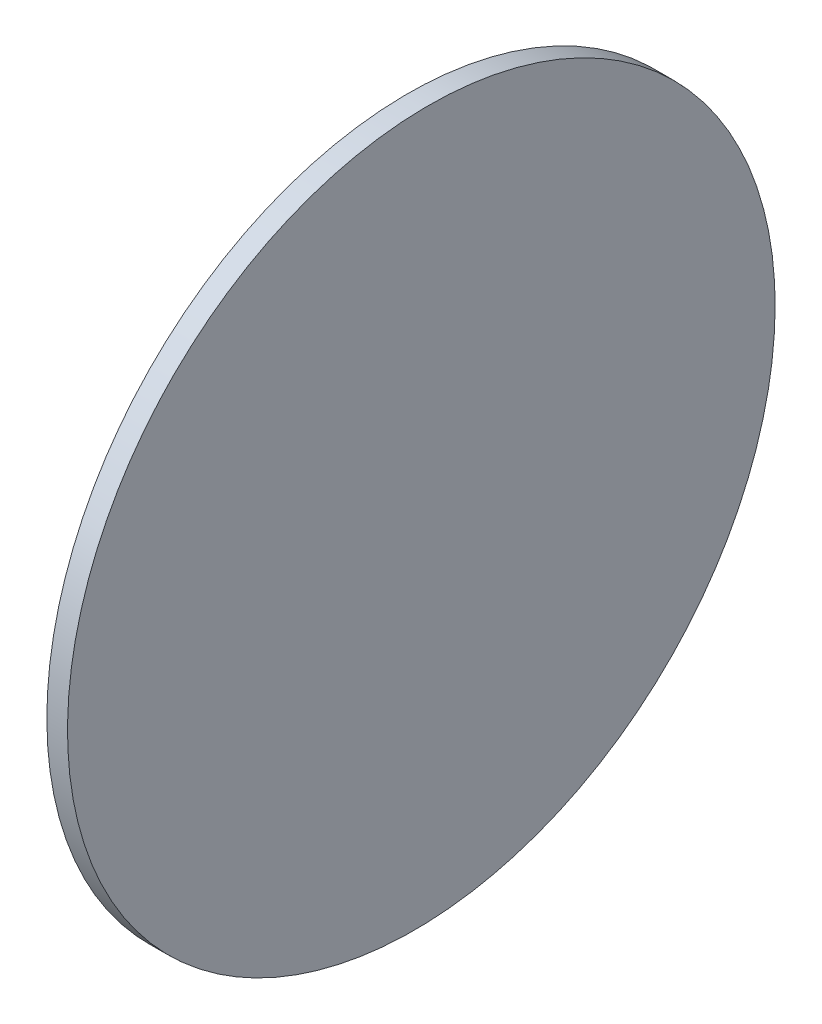
ISO-10303-21;
HEADER;
FILE_DESCRIPTION(('STEP AP214'),'2;1');
FILE_NAME('part.step','',(''),(''),'','','');
FILE_SCHEMA(('AUTOMOTIVE_DESIGN { 1 0 10303 214 1 1 1 1 }'));
ENDSEC;
DATA;
#1=APPLICATION_CONTEXT('core data for automotive mechanical design processes');
#2=APPLICATION_PROTOCOL_DEFINITION('international standard','automotive_design',2000,#1);
#3=PRODUCT_CONTEXT('',#1,'mechanical');
#4=PRODUCT('Part','Part','',(#3));
#5=PRODUCT_RELATED_PRODUCT_CATEGORY('part','',(#4));
#6=PRODUCT_DEFINITION_FORMATION('','',#4);
#7=PRODUCT_DEFINITION_CONTEXT('part definition',#1,'design');
#8=PRODUCT_DEFINITION('design','',#6,#7);
#9=PRODUCT_DEFINITION_SHAPE('','',#8);
#10=(LENGTH_UNIT() NAMED_UNIT(*) SI_UNIT(.MILLI.,.METRE.));
#11=(NAMED_UNIT(*) PLANE_ANGLE_UNIT() SI_UNIT($,.RADIAN.));
#12=(NAMED_UNIT(*) SI_UNIT($,.STERADIAN.) SOLID_ANGLE_UNIT());
#13=UNCERTAINTY_MEASURE_WITH_UNIT(LENGTH_MEASURE(1.E-05),#10,'distance_accuracy_value','');
#14=(GEOMETRIC_REPRESENTATION_CONTEXT(3) GLOBAL_UNCERTAINTY_ASSIGNED_CONTEXT((#13)) GLOBAL_UNIT_ASSIGNED_CONTEXT((#10,
#11,#12)) REPRESENTATION_CONTEXT('',''));
#15=CARTESIAN_POINT('',(0.,0.,0.));
#16=DIRECTION('',(0.,0.,1.));
#17=DIRECTION('',(1.,0.,0.));
#18=AXIS2_PLACEMENT_3D('',#15,#16,#17);
#19=CARTESIAN_POINT('',(172.576144765299,-46.4819307842796,22.7477112798652));
#20=CARTESIAN_POINT('',(172.588151885283,-46.482051063385,24.0263642070938));
#21=CARTESIAN_POINT('',(172.609643052937,-46.7341627331186,26.5836700615511));
#22=CARTESIAN_POINT('',(172.633071747198,-47.8534108071636,30.2722150984873));
#23=CARTESIAN_POINT('',(172.646792032658,-49.6707273748494,33.6715976734642));
#24=CARTESIAN_POINT('',(172.650276646441,-52.1162739796427,36.6511814205212));
#25=CARTESIAN_POINT('',(172.643391676793,-55.0960696369995,39.0964626072286));
#26=CARTESIAN_POINT('',(172.626401709236,-58.4956024708964,40.9134704489108));
#27=CARTESIAN_POINT('',(172.599959658696,-62.1842303410066,42.0323783532018));
#28=CARTESIAN_POINT('',(172.565081678347,-66.0202013468881,42.4101873168302));
#29=CARTESIAN_POINT('',(172.523108109413,-69.8561012740223,42.0323783532018));
#30=CARTESIAN_POINT('',(172.475651972609,-73.5445186394068,40.9134704489108));
#31=CARTESIAN_POINT('',(172.424536980659,-76.9437096321782,39.0964626072286));
#32=CARTESIAN_POINT('',(172.371727454038,-79.9230452487725,36.6511814205212));
#33=CARTESIAN_POINT('',(172.319252833238,-82.3680312922748,33.6715976734642));
#34=CARTESIAN_POINT('',(172.269129688508,-84.1847083201972,30.2722150984873));
#35=CARTESIAN_POINT('',(172.223284224192,-85.3032624531608,26.5836700615511));
#36=CARTESIAN_POINT('',(172.183478255771,-85.6807082831282,22.7477112798652));
#37=CARTESIAN_POINT('',(172.15124150429,-85.3025407785279,18.9117524981792));
#38=CARTESIAN_POINT('',(172.127812810029,-84.1832927044829,15.223207461243));
#39=CARTESIAN_POINT('',(172.114092524569,-82.3659761367971,11.8238248862661));
#40=CARTESIAN_POINT('',(172.110607910786,-79.9204295320038,8.84424113920915));
#41=CARTESIAN_POINT('',(172.117492880434,-76.940633874647,6.3989599525017));
#42=CARTESIAN_POINT('',(172.134482847991,-73.5411010407501,4.58195211081947));
#43=CARTESIAN_POINT('',(172.160924898531,-69.8524731706399,3.46304420652854));
#44=CARTESIAN_POINT('',(172.19580287888,-66.0165021647584,3.08523524290006));
#45=CARTESIAN_POINT('',(172.237776447814,-62.1806022376242,3.46304420652854));
#46=CARTESIAN_POINT('',(172.285232584618,-58.4921848722397,4.58195211081947));
#47=CARTESIAN_POINT('',(172.336347576568,-55.0929938794683,6.39895995250169));
#48=CARTESIAN_POINT('',(172.389157103189,-52.113658262874,8.84424113920914));
#49=CARTESIAN_POINT('',(172.441631723989,-49.6686722193717,11.8238248862661));
#50=CARTESIAN_POINT('',(172.491754868719,-47.8519951914493,15.223207461243));
#51=CARTESIAN_POINT('',(172.537600333035,-46.7334410584857,18.9117524981792));
#52=CARTESIAN_POINT('',(172.564137645316,-46.4818105051741,21.4690583526365));
#53=CARTESIAN_POINT('',(172.576144765299,-46.4819307842796,22.7477112798652));
#54=B_SPLINE_CURVE_WITH_KNOTS('',3,(#19,#20,#21,#22,#23,#24,#25,#26,#27,#28,#29,#30,#31,#32,#33,
#34,#35,#36,#37,#38,#39,#40,#41,#42,#43,#44,#45,#46,#47,#48,#49,#50,#51,#52,#53),.UNSPECIFIED.,
.T.,.F.,(4,1,1,1,1,1,1,1,1,1,1,1,1,1,1,1,1,1,1,1,1,1,1,1,1,1,1,1,1,1,1,1,4),(0.,0.03125,0.0625,
0.09375,0.125,0.15625,0.1875,0.21875,0.25,0.28125,0.3125,0.34375,0.375,0.40625,0.4375,0.46875,
0.5,0.53125,0.5625,0.59375,0.625,0.65625,0.6875,0.71875,0.75,0.78125,0.8125,0.84375,0.875,
0.90625,0.9375,0.96875,1.),.UNSPECIFIED.);
#55=DIRECTION('',(0.999905740949278,-0.0100163709739956,-0.00939050207319045));
#56=VECTOR('',#55,1.);
#57=SURFACE_OF_LINEAR_EXTRUSION('',#54,#56);
#58=CARTESIAN_POINT('',(172.576144765299,-46.4819307842796,22.7477112798652));
#59=CARTESIAN_POINT('',(172.588151885283,-46.482051063385,24.0263642070938));
#60=CARTESIAN_POINT('',(172.609643052937,-46.7341627331186,26.5836700615511));
#61=CARTESIAN_POINT('',(172.633071747198,-47.8534108071636,30.2722150984873));
#62=CARTESIAN_POINT('',(172.646792032658,-49.6707273748494,33.6715976734642));
#63=CARTESIAN_POINT('',(172.650276646441,-52.1162739796427,36.6511814205212));
#64=CARTESIAN_POINT('',(172.643391676793,-55.0960696369995,39.0964626072286));
#65=CARTESIAN_POINT('',(172.626401709236,-58.4956024708964,40.9134704489108));
#66=CARTESIAN_POINT('',(172.599959658696,-62.1842303410066,42.0323783532018));
#67=CARTESIAN_POINT('',(172.565081678347,-66.0202013468881,42.4101873168302));
#68=CARTESIAN_POINT('',(172.523108109413,-69.8561012740223,42.0323783532018));
#69=CARTESIAN_POINT('',(172.475651972609,-73.5445186394068,40.9134704489108));
#70=CARTESIAN_POINT('',(172.424536980659,-76.9437096321782,39.0964626072286));
#71=CARTESIAN_POINT('',(172.371727454038,-79.9230452487725,36.6511814205212));
#72=CARTESIAN_POINT('',(172.319252833238,-82.3680312922748,33.6715976734642));
#73=CARTESIAN_POINT('',(172.269129688508,-84.1847083201972,30.2722150984873));
#74=CARTESIAN_POINT('',(172.223284224192,-85.3032624531608,26.5836700615511));
#75=CARTESIAN_POINT('',(172.183478255771,-85.6807082831282,22.7477112798652));
#76=CARTESIAN_POINT('',(172.15124150429,-85.3025407785279,18.9117524981792));
#77=CARTESIAN_POINT('',(172.127812810029,-84.1832927044829,15.223207461243));
#78=CARTESIAN_POINT('',(172.114092524569,-82.3659761367971,11.8238248862661));
#79=CARTESIAN_POINT('',(172.110607910786,-79.9204295320038,8.84424113920915));
#80=CARTESIAN_POINT('',(172.117492880434,-76.940633874647,6.3989599525017));
#81=CARTESIAN_POINT('',(172.134482847991,-73.5411010407501,4.58195211081947));
#82=CARTESIAN_POINT('',(172.160924898531,-69.8524731706399,3.46304420652854));
#83=CARTESIAN_POINT('',(172.19580287888,-66.0165021647584,3.08523524290006));
#84=CARTESIAN_POINT('',(172.237776447814,-62.1806022376242,3.46304420652854));
#85=CARTESIAN_POINT('',(172.285232584618,-58.4921848722397,4.58195211081947));
#86=CARTESIAN_POINT('',(172.336347576568,-55.0929938794683,6.39895995250169));
#87=CARTESIAN_POINT('',(172.389157103189,-52.113658262874,8.84424113920914));
#88=CARTESIAN_POINT('',(172.441631723989,-49.6686722193717,11.8238248862661));
#89=CARTESIAN_POINT('',(172.491754868719,-47.8519951914493,15.223207461243));
#90=CARTESIAN_POINT('',(172.537600333035,-46.7334410584857,18.9117524981792));
#91=CARTESIAN_POINT('',(172.564137645316,-46.4818105051741,21.4690583526365));
#92=CARTESIAN_POINT('',(172.576144765299,-46.4819307842795,22.7477112798652));
#93=B_SPLINE_CURVE_WITH_KNOTS('',3,(#58,#59,#60,#61,#62,#63,#64,#65,#66,#67,#68,#69,#70,#71,#72,
#73,#74,#75,#76,#77,#78,#79,#80,#81,#82,#83,#84,#85,#86,#87,#88,#89,#90,#91,#92),.UNSPECIFIED.,
.T.,.F.,(4,1,1,1,1,1,1,1,1,1,1,1,1,1,1,1,1,1,1,1,1,1,1,1,1,1,1,1,1,1,1,1,4),(0.,0.03125,0.0625,
0.09375,0.125,0.15625,0.1875,0.21875,0.25,0.28125,0.3125,0.34375,0.375,0.40625,0.4375,0.46875,
0.5,0.53125,0.5625,0.59375,0.625,0.65625,0.6875,0.71875,0.75,0.78125,0.8125,0.84375,0.875,
0.90625,0.9375,0.96875,1.),.UNSPECIFIED.);
#94=CARTESIAN_POINT('',(172.576144765299,-46.4819307842796,22.7477112798652));
#95=VERTEX_POINT('',#94);
#96=EDGE_CURVE('E9',#95,#95,#93,.T.);
#97=ORIENTED_EDGE('',*,*,#96,.T.);
#98=EDGE_LOOP('',(#97));
#99=FACE_BOUND('',#98,.T.);
#100=CARTESIAN_POINT('',(173.695451924726,-46.4931432368974,22.7371994328273));
#101=CARTESIAN_POINT('',(173.692450125634,-46.4931132332414,22.4175342381722));
#102=CARTESIAN_POINT('',(173.689369502766,-46.5009541634282,22.0978713699998));
#103=CARTESIAN_POINT('',(173.683058533438,-46.5323022998333,21.4593134046187));
#104=CARTESIAN_POINT('',(173.679828185816,-46.5558096277449,21.1404183133933));
#105=CARTESIAN_POINT('',(173.673225737827,-46.6184149660599,20.50416400994));
#106=CARTESIAN_POINT('',(173.669853637459,-46.6575129764632,20.1868047977122));
#107=CARTESIAN_POINT('',(173.662975631274,-46.7512246080171,19.5543884095292));
#108=CARTESIAN_POINT('',(173.659469726497,-46.8058381086428,19.2393312157115));
#109=CARTESIAN_POINT('',(173.652332093129,-46.930505014563,18.6122880014878));
#110=CARTESIAN_POINT('',(173.648700364539,-47.0005584198575,18.300301981082));
#111=CARTESIAN_POINT('',(173.641320275868,-47.1558806839453,17.6801405064144));
#112=CARTESIAN_POINT('',(173.637571914881,-47.2411496609263,17.3719650817716));
#113=CARTESIAN_POINT('',(173.629967723381,-47.4266794608258,16.7601618588545));
#114=CARTESIAN_POINT('',(173.626111892868,-47.5269402837442,16.4565340605804));
#115=CARTESIAN_POINT('',(173.618301921399,-47.7422305729177,15.8545632754434));
#116=CARTESIAN_POINT('',(173.614347781205,-47.8572599244464,15.5562202475474));
#117=CARTESIAN_POINT('',(173.606350381615,-48.1018629953408,14.9655584681827));
#118=CARTESIAN_POINT('',(173.602307122218,-48.2314367147065,14.673239716714));
#119=CARTESIAN_POINT('',(173.594141533915,-48.5047641238662,14.0953079030036));
#120=CARTESIAN_POINT('',(173.590019204395,-48.6485179238009,13.8096948928685));
#121=CARTESIAN_POINT('',(173.581705492313,-48.9498423885281,13.2458538143099));
#122=CARTESIAN_POINT('',(173.577514109751,-49.1074130533206,12.9676257458864));
#123=CARTESIAN_POINT('',(173.569072306325,-49.4360085125163,12.4192340146386));
#124=CARTESIAN_POINT('',(173.564821885921,-49.6070332024006,12.1490702891881));
#125=CARTESIAN_POINT('',(173.556272055554,-49.962172480105,11.6174887319084));
#126=CARTESIAN_POINT('',(173.551972645591,-50.1462870679252,11.356070900079));
#127=CARTESIAN_POINT('',(173.543335356671,-50.5271158029257,10.8425783464918));
#128=CARTESIAN_POINT('',(173.538997477417,-50.7238300479669,10.5905036973259));
#129=CARTESIAN_POINT('',(173.530293736036,-51.1293694473756,10.0962928585849));
#130=CARTESIAN_POINT('',(173.525927873909,-51.3381946017431,9.85415666900976));
#131=CARTESIAN_POINT('',(173.517178652302,-51.7674674917295,9.38041837860503));
#132=CARTESIAN_POINT('',(173.512795292959,-51.9879151370536,9.14881619596304));
#133=CARTESIAN_POINT('',(173.504021597,-52.4399428182939,8.69674324182938));
#134=CARTESIAN_POINT('',(173.499631260384,-52.67152285421,8.47627247033771));
#135=CARTESIAN_POINT('',(173.490854197018,-53.1452178803355,8.04695240775705));
#136=CARTESIAN_POINT('',(173.486467470297,-53.3873329523653,7.83810320695573));
#137=CARTESIAN_POINT('',(173.477708179516,-53.8815026347655,7.43251485340335));
#138=CARTESIAN_POINT('',(173.473335615458,-54.133557245136,7.23577570065228));
#139=CARTESIAN_POINT('',(173.464615203349,-54.6470108494899,6.85489634791677));
#140=CARTESIAN_POINT('',(173.460267355108,-54.9084097708726,6.6707560500777));
#141=CARTESIAN_POINT('',(173.451606961773,-55.4399546853587,6.31556460919172));
#142=CARTESIAN_POINT('',(173.447294416679,-55.710100678462,6.14451346614481));
#143=CARTESIAN_POINT('',(173.438714876489,-56.2584581615097,5.81586442381034));
#144=CARTESIAN_POINT('',(173.434447881748,-56.5366697140896,5.6582666290364));
#145=CARTESIAN_POINT('',(173.425969656201,-57.1004790157203,5.35688729364308));
#146=CARTESIAN_POINT('',(173.421758425395,-57.3860767647711,5.21310575302371));
#147=CARTESIAN_POINT('',(173.413401943332,-57.9639793494254,4.93972231788344));
#148=CARTESIAN_POINT('',(173.409256691562,-58.2562841329121,4.81012031322618));
#149=CARTESIAN_POINT('',(173.40104241491,-58.846919307674,4.56546019346748));
#150=CARTESIAN_POINT('',(173.396973390027,-59.1452496989493,4.45040207836603));
#151=CARTESIAN_POINT('',(173.388921079932,-59.747196568368,4.23505385466615));
#152=CARTESIAN_POINT('',(173.384937795386,-60.0508130875553,4.13476386079088));
#153=CARTESIAN_POINT('',(173.377066448526,-60.6625951331427,3.94917538240032));
#154=CARTESIAN_POINT('',(173.373178386211,-60.9707606595429,3.86387689788502));
#155=CARTESIAN_POINT('',(173.365506969112,-61.5909037522607,3.70849535243725));
#156=CARTESIAN_POINT('',(173.361723613515,-61.9028812889484,3.63841217331914));
#157=CARTESIAN_POINT('',(173.354271123591,-62.5299089454522,3.51368552588305));
#158=CARTESIAN_POINT('',(173.350601989263,-62.8449590652683,3.45904205756508));
#159=CARTESIAN_POINT('',(173.343386355024,-63.477362840442,3.36527036396791));
#160=CARTESIAN_POINT('',(173.339839856064,-63.7947165136744,3.32614225921267));
#161=CARTESIAN_POINT('',(173.332877879336,-64.4309608622979,3.26347669897019));
#162=CARTESIAN_POINT('',(173.329462401567,-64.7498515376891,3.23993924348296));
#163=CARTESIAN_POINT('',(173.322770857689,-65.3884033871976,3.20853081338026));
#164=CARTESIAN_POINT('',(173.319494790498,-65.7080645553104,3.2006597170717));
#165=CARTESIAN_POINT('',(173.31309048231,-66.3473883723578,3.2006597170717));
#166=CARTESIAN_POINT('',(173.309962241313,-66.6670510212923,3.20853081338026));
#167=CARTESIAN_POINT('',(173.303860575706,-67.3056087797972,3.23993924348295));
#168=CARTESIAN_POINT('',(173.3008871523,-67.6245038833863,3.26347669897019));
#169=CARTESIAN_POINT('',(173.295102090564,-68.2607600215383,3.32614225921267));
#170=CARTESIAN_POINT('',(173.292290452236,-68.5781210561012,3.36527036396791));
#171=CARTESIAN_POINT('',(173.286835933859,-69.2105424729277,3.45904205756508));
#172=CARTESIAN_POINT('',(173.284193052499,-69.5256028730432,3.51368552588305));
#173=CARTESIAN_POINT('',(173.279083040019,-70.1526539948819,3.63841217331913));
#174=CARTESIAN_POINT('',(173.276615908899,-70.4646447166051,3.70849535243725));
#175=CARTESIAN_POINT('',(173.271862695513,-71.0848170418893,3.86387689788502));
#176=CARTESIAN_POINT('',(173.269576614653,-71.3929986158426,3.94917538240032));
#177=CARTESIAN_POINT('',(173.265190784589,-72.0048155769504,4.13476386079088));
#178=CARTESIAN_POINT('',(173.263091035385,-72.3084509641049,4.23505385466615));
#179=CARTESIAN_POINT('',(173.25908315659,-72.9104383478668,4.45040207836602));
#180=CARTESIAN_POINT('',(173.25717502551,-73.2087903854963,4.56546019346747));
#181=CARTESIAN_POINT('',(173.253555683653,-73.7994715891684,4.81012031322618));
#182=CARTESIAN_POINT('',(173.251844472876,-74.091800755211,4.93972231788344));
#183=CARTESIAN_POINT('',(173.248622375034,-74.6697547726103,5.2131057530237));
#184=CARTESIAN_POINT('',(173.247111489526,-74.9553795718711,5.35688729364307));
#185=CARTESIAN_POINT('',(173.244293436123,-75.5192455732303,5.65826662903639));
#186=CARTESIAN_POINT('',(173.242986268229,-75.7974867753286,5.81586442381034));
#187=CARTESIAN_POINT('',(173.240579049551,-76.3459060884664,6.14451346614481));
#188=CARTESIAN_POINT('',(173.239478997158,-76.6160842621217,6.31556460919172));
#189=CARTESIAN_POINT('',(173.237489415201,-77.1476960002279,6.6707560500777));
#190=CARTESIAN_POINT('',(173.236599885637,-77.4091295646789,6.85489634791677));
#191=CARTESIAN_POINT('',(173.235032726753,-77.922654825425,7.23577570065228));
#192=CARTESIAN_POINT('',(173.23435509908,-78.1747464491379,7.43251485340335));
#193=CARTESIAN_POINT('',(173.23321311855,-78.6689924365359,7.83810320695573));
#194=CARTESIAN_POINT('',(173.232748765694,-78.911146800221,8.04695240775705));
#195=CARTESIAN_POINT('',(173.232034715196,-79.3849225960878,8.4762724703377));
#196=CARTESIAN_POINT('',(173.231785015887,-79.6165441100729,8.69674324182938));
#197=CARTESIAN_POINT('',(173.231501652349,-80.0686568416492,9.14881619596304));
#198=CARTESIAN_POINT('',(173.23146798812,-80.2891480592403,9.38041837860502));
#199=CARTESIAN_POINT('',(173.231615993232,-80.7185100755511,9.85415666900976));
#200=CARTESIAN_POINT('',(173.231797664245,-80.9273807839914,10.0962928585849));
#201=CARTESIAN_POINT('',(173.23237564226,-81.3330131613088,10.5905036973259));
#202=CARTESIAN_POINT('',(173.232771949262,-81.529774830186,10.8425783464918));
#203=CARTESIAN_POINT('',(173.233778507505,-81.9107001706433,11.3560709000791));
#204=CARTESIAN_POINT('',(173.234388757084,-82.0948639400706,11.6174887319085));
#205=CARTESIAN_POINT('',(173.235822501467,-82.4501032263901,12.1490702891879));
#206=CARTESIAN_POINT('',(173.236645996271,-82.6211787432823,12.4192340146379));
#207=CARTESIAN_POINT('',(173.238503477624,-82.9498773736599,12.9676257458871));
#208=CARTESIAN_POINT('',(173.239537465808,-83.1075003826383,13.2458538143125));
#209=CARTESIAN_POINT('',(173.241813190996,-83.4089309250961,13.8096948928659));
#210=CARTESIAN_POINT('',(173.243054928001,-83.5527384585756,14.095307902994));
#211=CARTESIAN_POINT('',(173.245743413516,-83.8261745964149,14.6732397167236));
#212=CARTESIAN_POINT('',(173.247190160433,-83.9558033109056,14.9655584682184));
#213=CARTESIAN_POINT('',(173.250285914745,-84.2005175054156,15.5562202475117));
#214=CARTESIAN_POINT('',(173.251934922138,-84.3156029854349,15.8545632753102));
#215=CARTESIAN_POINT('',(173.255430497766,-84.5310065258503,16.4565340607136));
#216=CARTESIAN_POINT('',(173.257277067535,-84.6313244715277,16.7601618593516));
#217=CARTESIAN_POINT('',(173.261163085055,-84.8169693724235,17.3719650812744));
#218=CARTESIAN_POINT('',(173.263202532805,-84.9022963276418,17.6801405045591));
#219=CARTESIAN_POINT('',(173.267469628601,-85.0577352654308,18.3003019829372));
#220=CARTESIAN_POINT('',(173.269697275185,-85.1278473661835,18.6122880084117));
#221=CARTESIAN_POINT('',(173.274336071322,-85.2526322396263,19.2393312087876));
#222=CARTESIAN_POINT('',(173.276747220875,-85.3073050123164,19.554388383689));
#223=CARTESIAN_POINT('',(173.281746557767,-85.401135625511,20.1868048235526));
#224=CARTESIAN_POINT('',(173.284334746481,-85.4402933454941,20.5041641063782));
#225=CARTESIAN_POINT('',(173.289681718857,-85.5030183753972,21.140418216955));
#226=CARTESIAN_POINT('',(173.29244050252,-85.5265856853173,21.4593130447063));
#227=CARTESIAN_POINT('',(173.298122226499,-85.5580539918478,22.0978717299094));
#228=CARTESIAN_POINT('',(173.30104516554,-85.5659551101501,22.4175355813684));
#229=CARTESIAN_POINT('',(173.307048737169,-85.5660152498194,23.0568632842863));
#230=CARTESIAN_POINT('',(173.310129369757,-85.5581742711865,23.3765271357452));
#231=CARTESIAN_POINT('',(173.3164403462,-85.5268260993161,24.0150858209483));
#232=CARTESIAN_POINT('',(173.319670691218,-85.5033187843858,24.3339806486996));
#233=CARTESIAN_POINT('',(173.326273137301,-85.4407134555737,24.9702347592764));
#234=CARTESIAN_POINT('',(173.329645238366,-85.401615441692,25.287594042102));
#235=CARTESIAN_POINT('',(173.336523245062,-85.3079038075918,25.9200104819656));
#236=CARTESIAN_POINT('',(173.340029149652,-85.2532903078982,26.235067656867));
#237=CARTESIAN_POINT('',(173.347166782883,-85.1286234026603,26.8621108572429));
#238=CARTESIAN_POINT('',(173.350798511523,-85.058569997116,27.1740968827174));
#239=CARTESIAN_POINT('',(173.358178600231,-84.9032477328454,27.7942583610955));
#240=CARTESIAN_POINT('',(173.361926961205,-84.8179787559313,28.1024337843802));
#241=CARTESIAN_POINT('',(173.369531152695,-84.6324489560809,28.714237006303));
#242=CARTESIAN_POINT('',(173.373386983211,-84.5321881331444,29.017864804941));
#243=CARTESIAN_POINT('',(173.381196954683,-84.3168978439579,29.6198355903444));
#244=CARTESIAN_POINT('',(173.385151094876,-84.201868492434,29.9181786181429));
#245=CARTESIAN_POINT('',(173.393148494465,-83.9572654215431,30.5088403974362));
#246=CARTESIAN_POINT('',(173.397191753863,-83.8276917021762,30.801159148931));
#247=CARTESIAN_POINT('',(173.405357342166,-83.5543642930154,31.3790909626606));
#248=CARTESIAN_POINT('',(173.409479671686,-83.4106104930811,31.6647039727887));
#249=CARTESIAN_POINT('',(173.417793383768,-83.1092860283541,32.2285450513421));
#250=CARTESIAN_POINT('',(173.42198476633,-82.9517153635615,32.5067731197675));
#251=CARTESIAN_POINT('',(173.430426569755,-82.6231199043658,33.0551648510167));
#252=CARTESIAN_POINT('',(173.434676990159,-82.4520952144815,33.3253285764666));
#253=CARTESIAN_POINT('',(173.443226820527,-82.0969559367771,33.856910133746));
#254=CARTESIAN_POINT('',(173.44752623049,-81.9128413489569,34.1183279655755));
#255=CARTESIAN_POINT('',(173.456163519409,-81.5320126139564,34.6318205191628));
#256=CARTESIAN_POINT('',(173.460501398663,-81.3352983689152,34.8838951683287));
#257=CARTESIAN_POINT('',(173.469205140045,-80.9297589695065,35.3781060070697));
#258=CARTESIAN_POINT('',(173.473571002172,-80.7209338151391,35.6202421966448));
#259=CARTESIAN_POINT('',(173.482320223778,-80.2916609251527,36.0939804870496));
#260=CARTESIAN_POINT('',(173.486703583122,-80.0712132798285,36.3255826696916));
#261=CARTESIAN_POINT('',(173.495477279081,-79.6191855985882,36.7776556238252));
#262=CARTESIAN_POINT('',(173.499867615697,-79.3876055626721,36.9981263953169));
#263=CARTESIAN_POINT('',(173.508644679062,-78.9139105365466,37.4274464578975));
#264=CARTESIAN_POINT('',(173.513031405784,-78.6717954645169,37.6362956586989));
#265=CARTESIAN_POINT('',(173.521790696564,-78.1776257821166,38.0418840122512));
#266=CARTESIAN_POINT('',(173.526163260623,-77.9255711717462,38.2386231650023));
#267=CARTESIAN_POINT('',(173.534883672731,-77.4121175673922,38.6195025177378));
#268=CARTESIAN_POINT('',(173.539231520973,-77.1507186460095,38.8036428155769));
#269=CARTESIAN_POINT('',(173.547891914308,-76.6191737315235,39.1588342564629));
#270=CARTESIAN_POINT('',(173.552204459402,-76.3490277384201,39.3298853995098));
#271=CARTESIAN_POINT('',(173.560783999591,-75.8006702553725,39.6585344418443));
#272=CARTESIAN_POINT('',(173.565050994332,-75.5224587027925,39.8161322366182));
#273=CARTESIAN_POINT('',(173.57352921988,-74.9586494011618,40.1175115720115));
#274=CARTESIAN_POINT('',(173.577740450685,-74.673051652111,40.2612931126309));
#275=CARTESIAN_POINT('',(173.586096932749,-74.0951490674568,40.5346765477712));
#276=CARTESIAN_POINT('',(173.590242184518,-73.8028442839701,40.6642785524284));
#277=CARTESIAN_POINT('',(173.598456461171,-73.2122091092081,40.9089386721871));
#278=CARTESIAN_POINT('',(173.602525486053,-72.9138787179329,41.0239967872886));
#279=CARTESIAN_POINT('',(173.610577796148,-72.3119318485141,41.2393450109885));
#280=CARTESIAN_POINT('',(173.614561080694,-72.0083153293268,41.3396350048637));
#281=CARTESIAN_POINT('',(173.622432427555,-71.3965332837394,41.5252234832543));
#282=CARTESIAN_POINT('',(173.62632048987,-71.0883677573392,41.6105219677696));
#283=CARTESIAN_POINT('',(173.633991906968,-70.4682246646215,41.7659035132174));
#284=CARTESIAN_POINT('',(173.637775262566,-70.1562471279337,41.8359866923355));
#285=CARTESIAN_POINT('',(173.64522775249,-69.5292194714299,41.9607133397716));
#286=CARTESIAN_POINT('',(173.648896886817,-69.2141693516139,42.0153568080895));
#287=CARTESIAN_POINT('',(173.656112521057,-68.5817655764401,42.1091285016867));
#288=CARTESIAN_POINT('',(173.659659020016,-68.2644119032078,42.1482566064419));
#289=CARTESIAN_POINT('',(173.666620996745,-67.6281675545842,42.2109221666844));
#290=CARTESIAN_POINT('',(173.670036474514,-67.309276879193,42.2344596221716));
#291=CARTESIAN_POINT('',(173.676728018391,-66.6707250296846,42.2658680522743));
#292=CARTESIAN_POINT('',(173.680004085582,-66.3510638615717,42.2737391485829));
#293=CARTESIAN_POINT('',(173.68640839377,-65.7117400445243,42.2737391485829));
#294=CARTESIAN_POINT('',(173.689536634767,-65.3920773955899,42.2658680522743));
#295=CARTESIAN_POINT('',(173.695638300374,-64.7535196370849,42.2344596221716));
#296=CARTESIAN_POINT('',(173.698611723781,-64.4346245334958,42.2109221666844));
#297=CARTESIAN_POINT('',(173.704396785516,-63.7983683953438,42.1482566064419));
#298=CARTESIAN_POINT('',(173.707208423845,-63.4810073607809,42.1091285016867));
#299=CARTESIAN_POINT('',(173.712662942222,-62.8485859439545,42.0153568080895));
#300=CARTESIAN_POINT('',(173.715305823582,-62.533525543839,41.9607133397715));
#301=CARTESIAN_POINT('',(173.720415836061,-61.9064744220002,41.8359866923355));
#302=CARTESIAN_POINT('',(173.722882967181,-61.594483700277,41.7659035132173));
#303=CARTESIAN_POINT('',(173.727636180568,-60.9743113749929,41.6105219677696));
#304=CARTESIAN_POINT('',(173.729922261428,-60.6661298010395,41.5252234832543));
#305=CARTESIAN_POINT('',(173.734308091492,-60.0543128399317,41.3396350048637));
#306=CARTESIAN_POINT('',(173.736407840695,-59.7506774527773,41.2393450109884));
#307=CARTESIAN_POINT('',(173.74041571949,-59.1486900690154,41.0239967872886));
#308=CARTESIAN_POINT('',(173.74232385057,-58.8503380313858,40.9089386721871));
#309=CARTESIAN_POINT('',(173.745943192428,-58.2596568277137,40.6642785524284));
#310=CARTESIAN_POINT('',(173.747654403205,-57.9673276616711,40.5346765477712));
#311=CARTESIAN_POINT('',(173.750876501047,-57.3893736442718,40.2612931126309));
#312=CARTESIAN_POINT('',(173.752387386555,-57.103748845011,40.1175115720115));
#313=CARTESIAN_POINT('',(173.755205439957,-56.5398828436519,39.8161322366182));
#314=CARTESIAN_POINT('',(173.756512607851,-56.2616416415535,39.6585344418443));
#315=CARTESIAN_POINT('',(173.75891982653,-55.7132223284157,39.3298853995098));
#316=CARTESIAN_POINT('',(173.760019878923,-55.4430441547605,39.1588342564629));
#317=CARTESIAN_POINT('',(173.76200946088,-54.9114324166542,38.8036428155769));
#318=CARTESIAN_POINT('',(173.762898990444,-54.6499988522033,38.6195025177378));
#319=CARTESIAN_POINT('',(173.764466149328,-54.1364735914571,38.2386231650023));
#320=CARTESIAN_POINT('',(173.765143777001,-53.8843819677442,38.0418840122512));
#321=CARTESIAN_POINT('',(173.76628575753,-53.3901359803462,37.6362956586989));
#322=CARTESIAN_POINT('',(173.766750110386,-53.1479816166611,37.4274464578976));
#323=CARTESIAN_POINT('',(173.767464160884,-52.6742058207943,36.9981263953169));
#324=CARTESIAN_POINT('',(173.767713860193,-52.4425843068092,36.7776556238252));
#325=CARTESIAN_POINT('',(173.767997223732,-51.990471575233,36.3255826696916));
#326=CARTESIAN_POINT('',(173.76803088796,-51.7699803576418,36.0939804870496));
#327=CARTESIAN_POINT('',(173.767882882849,-51.340618341331,35.6202421966448));
#328=CARTESIAN_POINT('',(173.767701211836,-51.1317476328907,35.3781060070697));
#329=CARTESIAN_POINT('',(173.767123233821,-50.7261152555733,34.8838951683287));
#330=CARTESIAN_POINT('',(173.766726926819,-50.5293535866962,34.6318205191628));
#331=CARTESIAN_POINT('',(173.765720368576,-50.1484282462389,34.1183279655755));
#332=CARTESIAN_POINT('',(173.765110118997,-49.9642644768116,33.8569101337462));
#333=CARTESIAN_POINT('',(173.763676374614,-49.609025190492,33.3253285764665));
#334=CARTESIAN_POINT('',(173.76285287981,-49.4379496735998,33.055164851016));
#335=CARTESIAN_POINT('',(173.760995398457,-49.1092510432223,32.5067731197681));
#336=CARTESIAN_POINT('',(173.759961410273,-48.951628034244,32.2285450513447));
#337=CARTESIAN_POINT('',(173.757685685084,-48.6501974917859,31.6647039727861));
#338=CARTESIAN_POINT('',(173.75644394808,-48.5063899583061,31.379090962651));
#339=CARTESIAN_POINT('',(173.753755462565,-48.2329538204677,30.8011591489406));
#340=CARTESIAN_POINT('',(173.752308715647,-48.1033251059783,30.5088403974719));
#341=CARTESIAN_POINT('',(173.749212961336,-47.8586109114648,29.9181786181072));
#342=CARTESIAN_POINT('',(173.747563953942,-47.7435254314406,29.6198355902112));
#343=CARTESIAN_POINT('',(173.744068378316,-47.5281218910384,29.0178648050742));
#344=CARTESIAN_POINT('',(173.74222180855,-47.427803945379,28.7142370068001));
#345=CARTESIAN_POINT('',(173.738335791022,-47.2421590444341,28.102433783883));
#346=CARTESIAN_POINT('',(173.736296343259,-47.1568320891485,27.7942583592402));
#347=CARTESIAN_POINT('',(173.732029247496,-47.0013931515431,27.1740968845726));
#348=CARTESIAN_POINT('',(173.729801600957,-46.931281051041,26.8621108641668));
#349=CARTESIAN_POINT('',(173.725162804697,-46.8064961769133,26.2350676499431));
#350=CARTESIAN_POINT('',(173.722751654975,-46.7518234032878,25.9200104561254));
#351=CARTESIAN_POINT('',(173.717752318543,-46.6579927926491,25.2875940679424));
#352=CARTESIAN_POINT('',(173.715164130458,-46.6188350761577,24.9702348557146));
#353=CARTESIAN_POINT('',(173.709817156366,-46.5561100367153,24.3339805522613));
#354=CARTESIAN_POINT('',(173.707058370359,-46.5325427137644,24.0150854610359));
#355=CARTESIAN_POINT('',(173.701376652784,-46.5010744428346,23.3765274956548));
#356=CARTESIAN_POINT('',(173.69845372249,-46.4931733731634,23.0568646274824));
#357=CARTESIAN_POINT('',(173.695451924726,-46.4931432368974,22.7371994328273));
#358=B_SPLINE_CURVE_WITH_KNOTS('',3,(#100,#101,#102,#103,#104,#105,#106,#107,#108,#109,#110,
#111,#112,#113,#114,#115,#116,#117,#118,#119,#120,#121,#122,#123,#124,#125,#126,#127,#128,#129,
#130,#131,#132,#133,#134,#135,#136,#137,#138,#139,#140,#141,#142,#143,#144,#145,#146,#147,#148,
#149,#150,#151,#152,#153,#154,#155,#156,#157,#158,#159,#160,#161,#162,#163,#164,#165,#166,#167,
#168,#169,#170,#171,#172,#173,#174,#175,#176,#177,#178,#179,#180,#181,#182,#183,#184,#185,#186,
#187,#188,#189,#190,#191,#192,#193,#194,#195,#196,#197,#198,#199,#200,#201,#202,#203,#204,#205,
#206,#207,#208,#209,#210,#211,#212,#213,#214,#215,#216,#217,#218,#219,#220,#221,#222,#223,#224,
#225,#226,#227,#228,#229,#230,#231,#232,#233,#234,#235,#236,#237,#238,#239,#240,#241,#242,#243,
#244,#245,#246,#247,#248,#249,#250,#251,#252,#253,#254,#255,#256,#257,#258,#259,#260,#261,#262,
#263,#264,#265,#266,#267,#268,#269,#270,#271,#272,#273,#274,#275,#276,#277,#278,#279,#280,#281,
#282,#283,#284,#285,#286,#287,#288,#289,#290,#291,#292,#293,#294,#295,#296,#297,#298,#299,#300,
#301,#302,#303,#304,#305,#306,#307,#308,#309,#310,#311,#312,#313,#314,#315,#316,#317,#318,#319,
#320,#321,#322,#323,#324,#325,#326,#327,#328,#329,#330,#331,#332,#333,#334,#335,#336,#337,#338,
#339,#340,#341,#342,#343,#344,#345,#346,#347,#348,#349,#350,#351,#352,#353,#354,#355,#356,#357),
.UNSPECIFIED.,.F.,.F.,(4,2,2,2,2,2,2,2,2,2,2,2,2,2,2,2,2,2,2,2,2,2,2,2,2,2,2,2,2,2,2,2,2,2,2,2,
2,2,2,2,2,2,2,2,2,2,2,2,2,2,2,2,2,2,2,2,2,2,2,2,2,2,2,2,2,2,2,2,2,2,2,2,2,2,2,2,2,2,2,2,2,2,2,2,
2,2,2,2,2,2,2,2,2,2,2,2,2,2,2,2,2,2,2,2,2,2,2,2,2,2,2,2,2,2,2,2,2,2,2,2,2,2,2,2,2,2,2,2,4),(0.,
0.958937939115195,1.91788332715284,2.87682871519048,3.83576665430568,4.79470459342089,
5.75364998145853,6.71259536949617,7.67153330861137,8.63047124772658,9.58941663576421,
10.5483620238019,11.5072999629171,12.4662379020322,13.4251832900699,14.3841286781075,
15.3430666172227,16.3020045563379,17.2609499443756,18.2198953324132,19.1788332715284,
20.1377712106436,21.0967165986813,22.0556619867189,23.0145999258341,23.9735378649493,
24.9324832529869,25.8914286410246,26.8503665801398,27.809304519255,28.7682499072926,
29.7271952953303,30.6861332344455,31.6450711735607,32.6040165615983,33.5629619496359,
34.5218998887512,35.4808378278664,36.439783215904,37.3987286039416,38.3576665430568,
39.316604482172,40.2755498702097,41.2344952582473,42.1934331973625,43.1523711364777,
44.1113165245154,45.070261912553,46.0291998516682,46.9881377907834,47.9470831788211,
48.9060285668587,49.8649665059739,50.8239044450891,51.7828498331267,52.7417952211644,
53.7007331602796,54.6596710993948,55.6186164874324,56.5775618754701,57.5364998145853,
58.4954377537005,59.4543831417381,60.4133285297757,61.372266468891,62.3312044080062,
63.2901497960438,64.2490951840814,65.2080331231966,66.1669710623118,67.1259164503495,
68.0848618383871,69.0437997775023,70.0027377166175,70.9616831046552,71.9206284926928,
72.879566431808,73.8385043709232,74.7974497589608,75.7563951469985,76.7153330861137,
77.6742710252289,78.6332164132665,79.5921618013042,80.5510997404193,81.5100376795345,
82.4689830675722,83.4279284556098,84.386866394725,85.3458043338402,86.3047497218779,
87.2636951099155,88.2226330490307,89.1815709881459,90.1405163761835,91.0994617642212,
92.0583997033364,93.0173376424516,93.9762830304892,94.9352284185269,95.8941663576421,
96.8531042967573,97.8120496847949,98.7709950728326,99.7299330119478,100.688870951063,
101.647816339101,102.606761727138,103.565699666253,104.524637605369,105.483582993406,
106.442528381444,107.401466320559,108.360404259674,109.319349647712,110.27829503575,
111.237232974865,112.19617091398,113.155116302018,114.114061690055,115.07299962917,
116.031937568286,116.990882956323,117.949828344361,118.908766283476,119.867704222591,
120.826649610629,121.785594998667,122.744532937782),.UNSPECIFIED.);
#359=CARTESIAN_POINT('',(173.695451924726,-46.4931432368974,22.7371994328273));
#360=VERTEX_POINT('',#359);
#361=EDGE_CURVE('E24',#360,#360,#358,.F.);
#362=ORIENTED_EDGE('',*,*,#361,.F.);
#363=EDGE_LOOP('',(#362));
#364=FACE_BOUND('',#363,.T.);
#365=ADVANCED_FACE('F14',(#99,#364),#57,.T.);
#366=CARTESIAN_POINT('',(172.194941446334,-65.7881116806611,2.74989692556607));
#367=DIRECTION('',(0.999905740949278,-0.0100163709739956,-0.00939050207319045));
#368=DIRECTION('',(0.0100168126326601,0.99994983047385,0.));
#369=AXIS2_PLACEMENT_3D('',#366,#367,#368);
#370=PLANE('',#369);
#371=ORIENTED_EDGE('',*,*,#96,.F.);
#372=EDGE_LOOP('',(#371));
#373=FACE_BOUND('',#372,.T.);
#374=ADVANCED_FACE('F65',(#373),#370,.F.);
#375=CARTESIAN_POINT('',(173.314248605761,-65.799324133279,2.73938507852821));
#376=DIRECTION('',(0.999905740949278,-0.0100163709739956,-0.00939050207319045));
#377=DIRECTION('',(0.0100168126326601,0.99994983047385,0.));
#378=AXIS2_PLACEMENT_3D('',#375,#376,#377);
#379=PLANE('',#378);
#380=ORIENTED_EDGE('',*,*,#361,.T.);
#381=EDGE_LOOP('',(#380));
#382=FACE_BOUND('',#381,.T.);
#383=ADVANCED_FACE('F33',(#382),#379,.T.);
#384=CLOSED_SHELL('',(#365,#374,#383));
#385=MANIFOLD_SOLID_BREP('B1',#384);
#386=ADVANCED_BREP_SHAPE_REPRESENTATION('',(#18,#385),#14);
#387=SHAPE_DEFINITION_REPRESENTATION(#9,#386);
ENDSEC;
END-ISO-10303-21;
